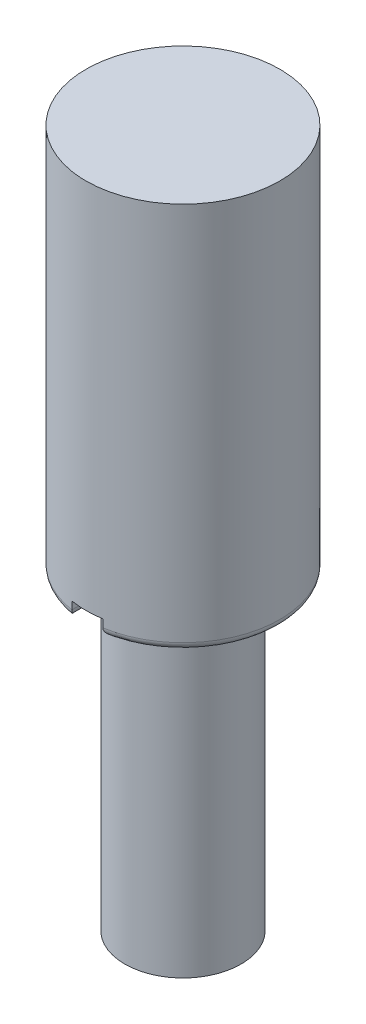
ISO-10303-21;
HEADER;
FILE_DESCRIPTION(('STEP AP214'),'2;1');
FILE_NAME('part.step','',(''),(''),'','','');
FILE_SCHEMA(('AUTOMOTIVE_DESIGN { 1 0 10303 214 1 1 1 1 }'));
ENDSEC;
DATA;
#1=APPLICATION_CONTEXT('core data for automotive mechanical design processes');
#2=APPLICATION_PROTOCOL_DEFINITION('international standard','automotive_design',2000,#1);
#3=PRODUCT_CONTEXT('',#1,'mechanical');
#4=PRODUCT('Part','Part','',(#3));
#5=PRODUCT_RELATED_PRODUCT_CATEGORY('part','',(#4));
#6=PRODUCT_DEFINITION_FORMATION('','',#4);
#7=PRODUCT_DEFINITION_CONTEXT('part definition',#1,'design');
#8=PRODUCT_DEFINITION('design','',#6,#7);
#9=PRODUCT_DEFINITION_SHAPE('','',#8);
#10=(LENGTH_UNIT() NAMED_UNIT(*) SI_UNIT(.MILLI.,.METRE.));
#11=(NAMED_UNIT(*) PLANE_ANGLE_UNIT() SI_UNIT($,.RADIAN.));
#12=(NAMED_UNIT(*) SI_UNIT($,.STERADIAN.) SOLID_ANGLE_UNIT());
#13=UNCERTAINTY_MEASURE_WITH_UNIT(LENGTH_MEASURE(1.E-05),#10,'distance_accuracy_value','');
#14=(GEOMETRIC_REPRESENTATION_CONTEXT(3) GLOBAL_UNCERTAINTY_ASSIGNED_CONTEXT((#13)) GLOBAL_UNIT_ASSIGNED_CONTEXT((#10,
#11,#12)) REPRESENTATION_CONTEXT('',''));
#15=CARTESIAN_POINT('',(0.,0.,0.));
#16=DIRECTION('',(0.,0.,1.));
#17=DIRECTION('',(1.,0.,0.));
#18=AXIS2_PLACEMENT_3D('',#15,#16,#17);
#19=CARTESIAN_POINT('',(0.,100.,0.));
#20=DIRECTION('',(0.,-1.,0.));
#21=DIRECTION('',(0.,0.,-1.));
#22=AXIS2_PLACEMENT_3D('',#19,#20,#21);
#23=CYLINDRICAL_SURFACE('',#22,25.);
#24=CARTESIAN_POINT('',(0.,100.,0.));
#25=DIRECTION('',(0.,1.,0.));
#26=DIRECTION('',(0.,0.,1.));
#27=AXIS2_PLACEMENT_3D('',#24,#25,#26);
#28=CIRCLE('',#27,25.);
#29=CARTESIAN_POINT('',(0.,100.,25.));
#30=VERTEX_POINT('',#29);
#31=EDGE_CURVE('E132',#30,#30,#28,.T.);
#32=ORIENTED_EDGE('',*,*,#31,.F.);
#33=EDGE_LOOP('',(#32));
#34=FACE_BOUND('',#33,.T.);
#35=DIRECTION('',(0.,-1.,0.));
#36=VECTOR('',#35,1.);
#37=CARTESIAN_POINT('',(4.,100.,24.6779253585061));
#38=LINE('',#37,#36);
#39=CARTESIAN_POINT('',(4.,2.,24.6779253585061));
#40=VERTEX_POINT('',#39);
#41=CARTESIAN_POINT('',(4.,4.,24.6779253585061));
#42=VERTEX_POINT('',#41);
#43=EDGE_CURVE('E107',#40,#42,#38,.F.);
#44=ORIENTED_EDGE('',*,*,#43,.F.);
#45=CARTESIAN_POINT('',(0.,2.,0.));
#46=DIRECTION('',(0.,1.,0.));
#47=DIRECTION('',(0.,0.,1.));
#48=AXIS2_PLACEMENT_3D('',#45,#46,#47);
#49=CIRCLE('',#48,25.);
#50=CARTESIAN_POINT('',(-4.,2.,24.6779253585061));
#51=VERTEX_POINT('',#50);
#52=EDGE_CURVE('E69',#40,#51,#49,.T.);
#53=ORIENTED_EDGE('',*,*,#52,.T.);
#54=DIRECTION('',(0.,-1.,0.));
#55=VECTOR('',#54,1.);
#56=CARTESIAN_POINT('',(-4.,100.,24.6779253585061));
#57=LINE('',#56,#55);
#58=CARTESIAN_POINT('',(-4.,4.,24.6779253585061));
#59=VERTEX_POINT('',#58);
#60=EDGE_CURVE('E126',#59,#51,#57,.T.);
#61=ORIENTED_EDGE('',*,*,#60,.F.);
#62=CARTESIAN_POINT('',(0.,4.,0.));
#63=DIRECTION('',(0.,-1.,0.));
#64=DIRECTION('',(0.,0.,-1.));
#65=AXIS2_PLACEMENT_3D('',#62,#63,#64);
#66=CIRCLE('',#65,25.);
#67=EDGE_CURVE('E137',#42,#59,#66,.T.);
#68=ORIENTED_EDGE('',*,*,#67,.F.);
#69=EDGE_LOOP('',(#44,#53,#61,#68));
#70=FACE_BOUND('',#69,.T.);
#71=ADVANCED_FACE('F39',(#34,#70),#23,.T.);
#72=CARTESIAN_POINT('',(0.,100.,0.));
#73=DIRECTION('',(0.,1.,0.));
#74=DIRECTION('',(0.,0.,1.));
#75=AXIS2_PLACEMENT_3D('',#72,#73,#74);
#76=PLANE('',#75);
#77=ORIENTED_EDGE('',*,*,#31,.T.);
#78=EDGE_LOOP('',(#77));
#79=FACE_BOUND('',#78,.T.);
#80=ADVANCED_FACE('F189',(#79),#76,.T.);
#81=CARTESIAN_POINT('',(0.,0.,0.));
#82=DIRECTION('',(0.,1.,0.));
#83=DIRECTION('',(0.,0.,1.));
#84=AXIS2_PLACEMENT_3D('',#81,#82,#83);
#85=PLANE('',#84);
#86=CARTESIAN_POINT('',(0.,0.,0.));
#87=DIRECTION('',(0.,1.,0.));
#88=DIRECTION('',(0.,0.,1.));
#89=AXIS2_PLACEMENT_3D('',#86,#87,#88);
#90=CIRCLE('',#89,23.);
#91=CARTESIAN_POINT('',(-6.,0.,22.2036033111745));
#92=VERTEX_POINT('',#91);
#93=CARTESIAN_POINT('',(6.,0.,22.2036033111745));
#94=VERTEX_POINT('',#93);
#95=EDGE_CURVE('E144',#92,#94,#90,.F.);
#96=ORIENTED_EDGE('',*,*,#95,.T.);
#97=DIRECTION('',(0.,0.,-1.));
#98=VECTOR('',#97,1.);
#99=CARTESIAN_POINT('',(6.,0.,20.));
#100=LINE('',#99,#98);
#101=CARTESIAN_POINT('',(6.,0.,18.));
#102=VERTEX_POINT('',#101);
#103=EDGE_CURVE('E150',#94,#102,#100,.T.);
#104=ORIENTED_EDGE('',*,*,#103,.T.);
#105=DIRECTION('',(-1.,0.,0.));
#106=VECTOR('',#105,1.);
#107=CARTESIAN_POINT('',(-4.,0.,18.));
#108=LINE('',#107,#106);
#109=CARTESIAN_POINT('',(-6.,0.,18.));
#110=VERTEX_POINT('',#109);
#111=EDGE_CURVE('E143',#102,#110,#108,.T.);
#112=ORIENTED_EDGE('',*,*,#111,.T.);
#113=DIRECTION('',(0.,0.,1.));
#114=VECTOR('',#113,1.);
#115=CARTESIAN_POINT('',(-6.,0.,24.6779253585061));
#116=LINE('',#115,#114);
#117=EDGE_CURVE('E141',#110,#92,#116,.T.);
#118=ORIENTED_EDGE('',*,*,#117,.T.);
#119=EDGE_LOOP('',(#96,#104,#112,#118));
#120=FACE_BOUND('',#119,.T.);
#121=CARTESIAN_POINT('',(0.,0.,0.));
#122=DIRECTION('',(0.,1.,0.));
#123=DIRECTION('',(0.,0.,1.));
#124=AXIS2_PLACEMENT_3D('',#121,#122,#123);
#125=CIRCLE('',#124,17.);
#126=CARTESIAN_POINT('',(0.,0.,17.));
#127=VERTEX_POINT('',#126);
#128=EDGE_CURVE('E138',#127,#127,#125,.T.);
#129=ORIENTED_EDGE('',*,*,#128,.T.);
#130=EDGE_LOOP('',(#129));
#131=FACE_BOUND('',#130,.T.);
#132=ADVANCED_FACE('F194',(#120,#131),#85,.F.);
#133=CARTESIAN_POINT('',(0.,-80.,0.));
#134=DIRECTION('',(0.,1.,0.));
#135=DIRECTION('',(0.,0.,1.));
#136=AXIS2_PLACEMENT_3D('',#133,#134,#135);
#137=CYLINDRICAL_SURFACE('',#136,15.);
#138=CARTESIAN_POINT('',(0.,-2.,0.));
#139=DIRECTION('',(0.,1.,0.));
#140=DIRECTION('',(0.,0.,1.));
#141=AXIS2_PLACEMENT_3D('',#138,#139,#140);
#142=CIRCLE('',#141,15.);
#143=CARTESIAN_POINT('',(0.,-2.,15.));
#144=VERTEX_POINT('',#143);
#145=EDGE_CURVE('E11',#144,#144,#142,.F.);
#146=ORIENTED_EDGE('',*,*,#145,.T.);
#147=EDGE_LOOP('',(#146));
#148=FACE_BOUND('',#147,.T.);
#149=CARTESIAN_POINT('',(0.,-80.,0.));
#150=DIRECTION('',(0.,1.,0.));
#151=DIRECTION('',(0.,0.,1.));
#152=AXIS2_PLACEMENT_3D('',#149,#150,#151);
#153=CIRCLE('',#152,15.);
#154=CARTESIAN_POINT('',(0.,-80.,15.));
#155=VERTEX_POINT('',#154);
#156=EDGE_CURVE('E128',#155,#155,#153,.T.);
#157=ORIENTED_EDGE('',*,*,#156,.T.);
#158=EDGE_LOOP('',(#157));
#159=FACE_BOUND('',#158,.T.);
#160=ADVANCED_FACE('F200',(#148,#159),#137,.T.);
#161=CARTESIAN_POINT('',(0.,-80.,0.));
#162=DIRECTION('',(0.,1.,0.));
#163=DIRECTION('',(0.,0.,1.));
#164=AXIS2_PLACEMENT_3D('',#161,#162,#163);
#165=PLANE('',#164);
#166=ORIENTED_EDGE('',*,*,#156,.F.);
#167=EDGE_LOOP('',(#166));
#168=FACE_BOUND('',#167,.T.);
#169=ADVANCED_FACE('F204',(#168),#165,.F.);
#170=CARTESIAN_POINT('',(0.,4.,0.));
#171=DIRECTION('',(0.,-1.,0.));
#172=DIRECTION('',(0.,0.,-1.));
#173=AXIS2_PLACEMENT_3D('',#170,#171,#172);
#174=PLANE('',#173);
#175=ORIENTED_EDGE('',*,*,#67,.T.);
#176=DIRECTION('',(0.,0.,1.));
#177=VECTOR('',#176,1.);
#178=CARTESIAN_POINT('',(-4.,4.,50.));
#179=LINE('',#178,#177);
#180=CARTESIAN_POINT('',(-4.,4.,20.));
#181=VERTEX_POINT('',#180);
#182=EDGE_CURVE('E114',#181,#59,#179,.T.);
#183=ORIENTED_EDGE('',*,*,#182,.F.);
#184=DIRECTION('',(-1.,0.,0.));
#185=VECTOR('',#184,1.);
#186=CARTESIAN_POINT('',(-4.,4.,20.));
#187=LINE('',#186,#185);
#188=CARTESIAN_POINT('',(4.,4.,20.));
#189=VERTEX_POINT('',#188);
#190=EDGE_CURVE('E115',#189,#181,#187,.T.);
#191=ORIENTED_EDGE('',*,*,#190,.F.);
#192=DIRECTION('',(0.,0.,-1.));
#193=VECTOR('',#192,1.);
#194=CARTESIAN_POINT('',(4.,4.,50.));
#195=LINE('',#194,#193);
#196=EDGE_CURVE('E105',#42,#189,#195,.T.);
#197=ORIENTED_EDGE('',*,*,#196,.F.);
#198=EDGE_LOOP('',(#175,#183,#191,#197));
#199=FACE_BOUND('',#198,.T.);
#200=ADVANCED_FACE('F122',(#199),#174,.T.);
#201=CARTESIAN_POINT('',(-4.,4.,50.));
#202=DIRECTION('',(1.,0.,0.));
#203=DIRECTION('',(0.,0.,-1.));
#204=AXIS2_PLACEMENT_3D('',#201,#202,#203);
#205=PLANE('',#204);
#206=ORIENTED_EDGE('',*,*,#60,.T.);
#207=DIRECTION('',(0.,0.,1.));
#208=VECTOR('',#207,1.);
#209=CARTESIAN_POINT('',(-4.,2.,20.));
#210=LINE('',#209,#208);
#211=CARTESIAN_POINT('',(-4.,2.,20.));
#212=VERTEX_POINT('',#211);
#213=EDGE_CURVE('E63',#51,#212,#210,.F.);
#214=ORIENTED_EDGE('',*,*,#213,.T.);
#215=DIRECTION('',(0.,-1.,0.));
#216=VECTOR('',#215,1.);
#217=CARTESIAN_POINT('',(-4.,4.,20.));
#218=LINE('',#217,#216);
#219=EDGE_CURVE('E117',#181,#212,#218,.T.);
#220=ORIENTED_EDGE('',*,*,#219,.F.);
#221=ORIENTED_EDGE('',*,*,#182,.T.);
#222=EDGE_LOOP('',(#206,#214,#220,#221));
#223=FACE_BOUND('',#222,.T.);
#224=ADVANCED_FACE('F207',(#223),#205,.T.);
#225=CARTESIAN_POINT('',(4.,4.,50.));
#226=DIRECTION('',(-1.,0.,0.));
#227=DIRECTION('',(0.,0.,1.));
#228=AXIS2_PLACEMENT_3D('',#225,#226,#227);
#229=PLANE('',#228);
#230=DIRECTION('',(0.,-1.,0.));
#231=VECTOR('',#230,1.);
#232=CARTESIAN_POINT('',(4.,4.,20.));
#233=LINE('',#232,#231);
#234=CARTESIAN_POINT('',(4.,2.,20.));
#235=VERTEX_POINT('',#234);
#236=EDGE_CURVE('E106',#189,#235,#233,.T.);
#237=ORIENTED_EDGE('',*,*,#236,.T.);
#238=DIRECTION('',(0.,0.,-1.));
#239=VECTOR('',#238,1.);
#240=CARTESIAN_POINT('',(4.,2.,24.6779253585061));
#241=LINE('',#240,#239);
#242=EDGE_CURVE('E147',#235,#40,#241,.F.);
#243=ORIENTED_EDGE('',*,*,#242,.T.);
#244=ORIENTED_EDGE('',*,*,#43,.T.);
#245=ORIENTED_EDGE('',*,*,#196,.T.);
#246=EDGE_LOOP('',(#237,#243,#244,#245));
#247=FACE_BOUND('',#246,.T.);
#248=ADVANCED_FACE('F102',(#247),#229,.T.);
#249=CARTESIAN_POINT('',(-4.,4.,20.));
#250=DIRECTION('',(0.,0.,1.));
#251=DIRECTION('',(1.,0.,0.));
#252=AXIS2_PLACEMENT_3D('',#249,#250,#251);
#253=PLANE('',#252);
#254=ORIENTED_EDGE('',*,*,#219,.T.);
#255=DIRECTION('',(-1.,0.,0.));
#256=VECTOR('',#255,1.);
#257=CARTESIAN_POINT('',(4.,2.,20.));
#258=LINE('',#257,#256);
#259=EDGE_CURVE('E52',#212,#235,#258,.F.);
#260=ORIENTED_EDGE('',*,*,#259,.T.);
#261=ORIENTED_EDGE('',*,*,#236,.F.);
#262=ORIENTED_EDGE('',*,*,#190,.T.);
#263=EDGE_LOOP('',(#254,#260,#261,#262));
#264=FACE_BOUND('',#263,.T.);
#265=ADVANCED_FACE('F118',(#264),#253,.T.);
#266=CARTESIAN_POINT('',(-6.,2.,0.));
#267=DIRECTION('',(0.,0.,-1.));
#268=DIRECTION('',(-1.,0.,0.));
#269=AXIS2_PLACEMENT_3D('',#266,#267,#268);
#270=CYLINDRICAL_SURFACE('',#269,2.);
#271=CARTESIAN_POINT('',(-6.,2.,18.));
#272=DIRECTION('',(0.707106781186547,0.,-0.707106781186547));
#273=DIRECTION('',(-0.707106781186547,0.,-0.707106781186547));
#274=AXIS2_PLACEMENT_3D('',#271,#272,#273);
#275=ELLIPSE('',#274,2.82842712474619,2.);
#276=EDGE_CURVE('E162',#212,#110,#275,.T.);
#277=ORIENTED_EDGE('',*,*,#276,.F.);
#278=ORIENTED_EDGE('',*,*,#213,.F.);
#279=CARTESIAN_POINT('',(-4.,2.,24.6779253585061));
#280=CARTESIAN_POINT('',(-3.9999881835096,1.95743367170297,24.6779386185522));
#281=CARTESIAN_POINT('',(-4.00135849338556,1.91487734261805,24.6763289275061));
#282=CARTESIAN_POINT('',(-4.00677220802352,1.8302118312993,24.6699661577945));
#283=CARTESIAN_POINT('',(-4.01081301713366,1.78810225517529,24.6652161314472));
#284=CARTESIAN_POINT('',(-4.02142366855468,1.70508969681857,24.6527374403877));
#285=CARTESIAN_POINT('',(-4.02796786174339,1.66417886594117,24.6450389837227));
#286=CARTESIAN_POINT('',(-4.04342726153007,1.58344906946089,24.6268410870079));
#287=CARTESIAN_POINT('',(-4.05234289977568,1.54363030409148,24.6163411370324));
#288=CARTESIAN_POINT('',(-4.0823000067499,1.42651385860002,24.5810323710432));
#289=CARTESIAN_POINT('',(-4.10660342004153,1.35117141418194,24.5523539504213));
#290=CARTESIAN_POINT('',(-4.16228557513725,1.20702039934697,24.4864967351227));
#291=CARTESIAN_POINT('',(-4.19368319877452,1.13822997527998,24.4492952518405));
#292=CARTESIAN_POINT('',(-4.27808297797088,0.976890069513704,24.3490189892868));
#293=CARTESIAN_POINT('',(-4.33428633637045,0.888458112540812,24.2820213455887));
#294=CARTESIAN_POINT('',(-4.45457430980616,0.72646658158146,24.1379349236266));
#295=CARTESIAN_POINT('',(-4.51867499394272,0.652938163832636,24.0608255492776));
#296=CARTESIAN_POINT('',(-4.63584020182857,0.53570240975483,23.919134933763));
#297=CARTESIAN_POINT('',(-4.68783079140212,0.489081816754881,23.8560261727259));
#298=CARTESIAN_POINT('',(-4.7939362599736,0.403104994496,23.7266915098132));
#299=CARTESIAN_POINT('',(-4.84805225537268,0.363752646586344,23.6604639660151));
#300=CARTESIAN_POINT('',(-5.01270472035285,0.255716517850423,23.4580745590897));
#301=CARTESIAN_POINT('',(-5.12547453266975,0.197121417432871,23.3182917617809));
#302=CARTESIAN_POINT('',(-5.36427478722113,0.0989233271467947,23.0194820272165));
#303=CARTESIAN_POINT('',(-5.49053757148394,0.0616885991445657,22.8598971514706));
#304=CARTESIAN_POINT('',(-5.74302119351891,0.0124270423142568,22.5373184410378));
#305=CARTESIAN_POINT('',(-5.8692416756567,0.000353641446518051,22.3743314694525));
#306=CARTESIAN_POINT('',(-5.99631047535665,2.56016324440143E-06,22.2084217883558));
#307=CARTESIAN_POINT('',(-5.99815534762555,8.35693465733212E-09,22.2060126033877));
#308=CARTESIAN_POINT('',(-6.,0.,22.2036033111745));
#309=B_SPLINE_CURVE_WITH_KNOTS('',3,(#279,#280,#281,#282,#283,#284,#285,#286,#287,#288,#289,
#290,#291,#292,#293,#294,#295,#296,#297,#298,#299,#300,#301,#302,#303,#304,#305,#306,#307,#308),
.UNSPECIFIED.,.F.,.F.,(4,2,2,2,2,2,2,2,2,2,2,2,2,2,4),(0.,0.127630333172937,0.25513679525857,
0.381370405502,0.507627008380657,0.75897826965825,1.01100657291047,1.38203135889782,
1.7538239588149,2.03581613031301,2.31795845709146,2.88262993179227,3.50160332289144,
4.11943001178813,4.12853327995911),.UNSPECIFIED.);
#310=EDGE_CURVE('E43',#92,#51,#309,.F.);
#311=ORIENTED_EDGE('',*,*,#310,.F.);
#312=ORIENTED_EDGE('',*,*,#117,.F.);
#313=EDGE_LOOP('',(#277,#278,#311,#312));
#314=FACE_BOUND('',#313,.T.);
#315=ADVANCED_FACE('F171',(#314),#270,.T.);
#316=CARTESIAN_POINT('',(0.,2.,0.));
#317=DIRECTION('',(0.,1.,0.));
#318=DIRECTION('',(0.,0.,1.));
#319=AXIS2_PLACEMENT_3D('',#316,#317,#318);
#320=TOROIDAL_SURFACE('',#319,23.,2.);
#321=ORIENTED_EDGE('',*,*,#310,.T.);
#322=ORIENTED_EDGE('',*,*,#52,.F.);
#323=CARTESIAN_POINT('',(4.,2.,24.6779253585061));
#324=CARTESIAN_POINT('',(3.9999881835096,1.95743367170297,24.6779386185522));
#325=CARTESIAN_POINT('',(4.00135849338556,1.91487734261805,24.6763289275061));
#326=CARTESIAN_POINT('',(4.00677220802352,1.8302118312993,24.6699661577945));
#327=CARTESIAN_POINT('',(4.01081301713366,1.78810225517529,24.6652161314472));
#328=CARTESIAN_POINT('',(4.02142366855468,1.70508969681857,24.6527374403877));
#329=CARTESIAN_POINT('',(4.02796786174339,1.66417886594117,24.6450389837227));
#330=CARTESIAN_POINT('',(4.04342726153007,1.58344906946089,24.6268410870079));
#331=CARTESIAN_POINT('',(4.05234289977568,1.54363030409148,24.6163411370324));
#332=CARTESIAN_POINT('',(4.0823000067499,1.42651385860002,24.5810323710432));
#333=CARTESIAN_POINT('',(4.10660342004154,1.35117141418194,24.5523539504213));
#334=CARTESIAN_POINT('',(4.16228557513725,1.20702039934697,24.4864967351227));
#335=CARTESIAN_POINT('',(4.19368319877452,1.13822997527998,24.4492952518405));
#336=CARTESIAN_POINT('',(4.27808297797088,0.976890069513704,24.3490189892868));
#337=CARTESIAN_POINT('',(4.33428633637045,0.888458112540811,24.2820213455887));
#338=CARTESIAN_POINT('',(4.45457430980616,0.726466581581459,24.1379349236266));
#339=CARTESIAN_POINT('',(4.51867499394272,0.652938163832636,24.0608255492776));
#340=CARTESIAN_POINT('',(4.63584020182857,0.53570240975483,23.919134933763));
#341=CARTESIAN_POINT('',(4.68783079140212,0.48908181675488,23.8560261727259));
#342=CARTESIAN_POINT('',(4.7939362599736,0.403104994495999,23.7266915098132));
#343=CARTESIAN_POINT('',(4.84805225537268,0.363752646586344,23.6604639660151));
#344=CARTESIAN_POINT('',(5.01270472035285,0.255716517850423,23.4580745590897));
#345=CARTESIAN_POINT('',(5.12547453266975,0.197121417432871,23.3182917617809));
#346=CARTESIAN_POINT('',(5.36427478722113,0.098923327146795,23.0194820272165));
#347=CARTESIAN_POINT('',(5.49053757148395,0.0616885991445664,22.8598971514706));
#348=CARTESIAN_POINT('',(5.74302119351891,0.0124270423142556,22.5373184410378));
#349=CARTESIAN_POINT('',(5.86924167565669,0.000353641446514306,22.3743314694525));
#350=CARTESIAN_POINT('',(5.99631047535665,2.56016324429154E-06,22.2084217883558));
#351=CARTESIAN_POINT('',(5.99815534762555,8.35693460155517E-09,22.2060126033877));
#352=CARTESIAN_POINT('',(6.,0.,22.2036033111745));
#353=B_SPLINE_CURVE_WITH_KNOTS('',3,(#323,#324,#325,#326,#327,#328,#329,#330,#331,#332,#333,
#334,#335,#336,#337,#338,#339,#340,#341,#342,#343,#344,#345,#346,#347,#348,#349,#350,#351,#352),
.UNSPECIFIED.,.F.,.F.,(4,2,2,2,2,2,2,2,2,2,2,2,2,2,4),(0.,0.127630333172937,0.25513679525857,
0.381370405502,0.507627008380657,0.75897826965825,1.01100657291047,1.38203135889782,
1.7538239588149,2.03581613031301,2.31795845709146,2.88262993179227,3.50160332289144,
4.11943001178813,4.12853327995911),.UNSPECIFIED.);
#354=EDGE_CURVE('E160',#94,#40,#353,.F.);
#355=ORIENTED_EDGE('',*,*,#354,.F.);
#356=ORIENTED_EDGE('',*,*,#95,.F.);
#357=EDGE_LOOP('',(#321,#322,#355,#356));
#358=FACE_BOUND('',#357,.T.);
#359=ADVANCED_FACE('F163',(#358),#320,.T.);
#360=CARTESIAN_POINT('',(0.,2.,18.));
#361=DIRECTION('',(1.,0.,0.));
#362=DIRECTION('',(0.,0.,-1.));
#363=AXIS2_PLACEMENT_3D('',#360,#361,#362);
#364=CYLINDRICAL_SURFACE('',#363,2.);
#365=ORIENTED_EDGE('',*,*,#276,.T.);
#366=ORIENTED_EDGE('',*,*,#111,.F.);
#367=CARTESIAN_POINT('',(6.,2.,18.));
#368=DIRECTION('',(0.707106781186547,0.,0.707106781186547));
#369=DIRECTION('',(-0.707106781186547,0.,0.707106781186547));
#370=AXIS2_PLACEMENT_3D('',#367,#368,#369);
#371=ELLIPSE('',#370,2.82842712474619,2.);
#372=EDGE_CURVE('E154',#235,#102,#371,.T.);
#373=ORIENTED_EDGE('',*,*,#372,.F.);
#374=ORIENTED_EDGE('',*,*,#259,.F.);
#375=EDGE_LOOP('',(#365,#366,#373,#374));
#376=FACE_BOUND('',#375,.T.);
#377=ADVANCED_FACE('F173',(#376),#364,.T.);
#378=CARTESIAN_POINT('',(6.,2.,0.));
#379=DIRECTION('',(0.,0.,1.));
#380=DIRECTION('',(1.,0.,0.));
#381=AXIS2_PLACEMENT_3D('',#378,#379,#380);
#382=CYLINDRICAL_SURFACE('',#381,2.);
#383=ORIENTED_EDGE('',*,*,#354,.T.);
#384=ORIENTED_EDGE('',*,*,#242,.F.);
#385=ORIENTED_EDGE('',*,*,#372,.T.);
#386=ORIENTED_EDGE('',*,*,#103,.F.);
#387=EDGE_LOOP('',(#383,#384,#385,#386));
#388=FACE_BOUND('',#387,.T.);
#389=ADVANCED_FACE('F170',(#388),#382,.T.);
#390=CARTESIAN_POINT('',(0.,-2.,0.));
#391=DIRECTION('',(0.,1.,0.));
#392=DIRECTION('',(0.,0.,1.));
#393=AXIS2_PLACEMENT_3D('',#390,#391,#392);
#394=TOROIDAL_SURFACE('',#393,17.,2.);
#395=ORIENTED_EDGE('',*,*,#145,.F.);
#396=EDGE_LOOP('',(#395));
#397=FACE_BOUND('',#396,.T.);
#398=ORIENTED_EDGE('',*,*,#128,.F.);
#399=EDGE_LOOP('',(#398));
#400=FACE_BOUND('',#399,.T.);
#401=ADVANCED_FACE('F41',(#397,#400),#394,.F.);
#402=CLOSED_SHELL('',(#71,#80,#132,#160,#169,#200,#224,#248,#265,#315,#359,#377,#389,#401));
#403=MANIFOLD_SOLID_BREP('B2',#402);
#404=ADVANCED_BREP_SHAPE_REPRESENTATION('',(#18,#403),#14);
#405=SHAPE_DEFINITION_REPRESENTATION(#9,#404);
ENDSEC;
END-ISO-10303-21;
